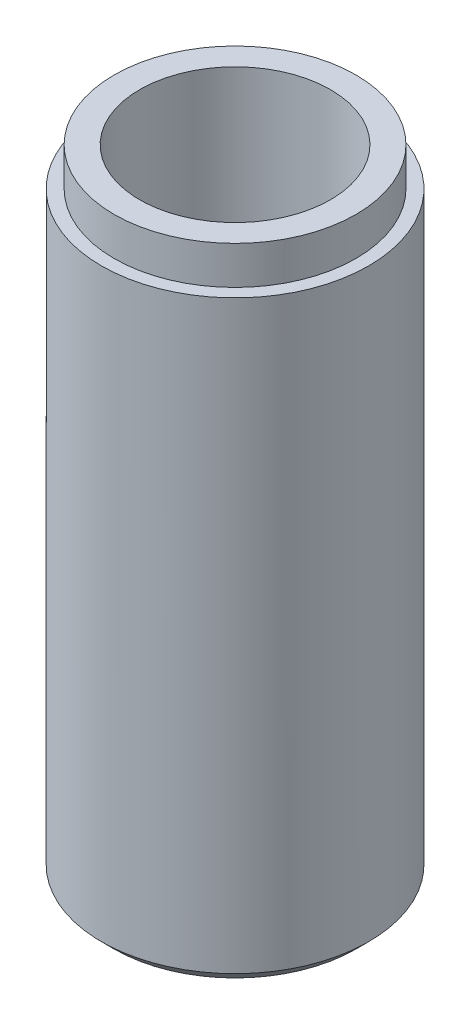
ISO-10303-21;
HEADER;
FILE_DESCRIPTION(('STEP AP214'),'2;1');
FILE_NAME('part.step','',(''),(''),'','','');
FILE_SCHEMA(('AUTOMOTIVE_DESIGN { 1 0 10303 214 1 1 1 1 }'));
ENDSEC;
DATA;
#1=APPLICATION_CONTEXT('core data for automotive mechanical design processes');
#2=APPLICATION_PROTOCOL_DEFINITION('international standard','automotive_design',2000,#1);
#3=PRODUCT_CONTEXT('',#1,'mechanical');
#4=PRODUCT('Part','Part','',(#3));
#5=PRODUCT_RELATED_PRODUCT_CATEGORY('part','',(#4));
#6=PRODUCT_DEFINITION_FORMATION('','',#4);
#7=PRODUCT_DEFINITION_CONTEXT('part definition',#1,'design');
#8=PRODUCT_DEFINITION('design','',#6,#7);
#9=PRODUCT_DEFINITION_SHAPE('','',#8);
#10=(LENGTH_UNIT() NAMED_UNIT(*) SI_UNIT(.MILLI.,.METRE.));
#11=(NAMED_UNIT(*) PLANE_ANGLE_UNIT() SI_UNIT($,.RADIAN.));
#12=(NAMED_UNIT(*) SI_UNIT($,.STERADIAN.) SOLID_ANGLE_UNIT());
#13=UNCERTAINTY_MEASURE_WITH_UNIT(LENGTH_MEASURE(1.E-05),#10,'distance_accuracy_value','');
#14=(GEOMETRIC_REPRESENTATION_CONTEXT(3) GLOBAL_UNCERTAINTY_ASSIGNED_CONTEXT((#13)) GLOBAL_UNIT_ASSIGNED_CONTEXT((#10,
#11,#12)) REPRESENTATION_CONTEXT('',''));
#15=CARTESIAN_POINT('',(0.,0.,0.));
#16=DIRECTION('',(0.,0.,1.));
#17=DIRECTION('',(1.,0.,0.));
#18=AXIS2_PLACEMENT_3D('',#15,#16,#17);
#19=CARTESIAN_POINT('',(0.,0.,0.));
#20=DIRECTION('',(0.,-1.,0.));
#21=DIRECTION('',(0.,0.,-1.));
#22=AXIS2_PLACEMENT_3D('',#19,#20,#21);
#23=CYLINDRICAL_SURFACE('',#22,10.5);
#24=CARTESIAN_POINT('',(0.,0.999999999999982,0.));
#25=DIRECTION('',(0.,-1.,0.));
#26=DIRECTION('',(0.,0.,-1.));
#27=AXIS2_PLACEMENT_3D('',#24,#25,#26);
#28=CIRCLE('',#27,10.5);
#29=CARTESIAN_POINT('',(0.,0.999999999999982,-10.5));
#30=VERTEX_POINT('',#29);
#31=EDGE_CURVE('E11',#30,#30,#28,.F.);
#32=ORIENTED_EDGE('',*,*,#31,.T.);
#33=EDGE_LOOP('',(#32));
#34=FACE_BOUND('',#33,.T.);
#35=CARTESIAN_POINT('',(0.,47.,0.));
#36=DIRECTION('',(0.,1.,0.));
#37=DIRECTION('',(0.,0.,1.));
#38=AXIS2_PLACEMENT_3D('',#35,#36,#37);
#39=CIRCLE('',#38,10.5);
#40=CARTESIAN_POINT('',(0.,47.,10.5));
#41=VERTEX_POINT('',#40);
#42=EDGE_CURVE('E35',#41,#41,#39,.F.);
#43=ORIENTED_EDGE('',*,*,#42,.T.);
#44=EDGE_LOOP('',(#43));
#45=FACE_BOUND('',#44,.T.);
#46=ADVANCED_FACE('F31',(#34,#45),#23,.T.);
#47=CARTESIAN_POINT('',(7.5,50.,0.));
#48=DIRECTION('',(0.,1.,0.));
#49=DIRECTION('',(0.,0.,1.));
#50=AXIS2_PLACEMENT_3D('',#47,#48,#49);
#51=PLANE('',#50);
#52=CARTESIAN_POINT('',(0.,50.,0.));
#53=DIRECTION('',(0.,-1.,0.));
#54=DIRECTION('',(0.,0.,-1.));
#55=AXIS2_PLACEMENT_3D('',#52,#53,#54);
#56=CIRCLE('',#55,7.5);
#57=CARTESIAN_POINT('',(0.,50.,-7.5));
#58=VERTEX_POINT('',#57);
#59=EDGE_CURVE('E43',#58,#58,#56,.T.);
#60=ORIENTED_EDGE('',*,*,#59,.T.);
#61=EDGE_LOOP('',(#60));
#62=FACE_BOUND('',#61,.T.);
#63=CARTESIAN_POINT('',(0.,50.,0.));
#64=DIRECTION('',(0.,1.,0.));
#65=DIRECTION('',(0.,0.,1.));
#66=AXIS2_PLACEMENT_3D('',#63,#64,#65);
#67=CIRCLE('',#66,9.5);
#68=CARTESIAN_POINT('',(0.,50.,9.5));
#69=VERTEX_POINT('',#68);
#70=EDGE_CURVE('E51',#69,#69,#67,.T.);
#71=ORIENTED_EDGE('',*,*,#70,.T.);
#72=EDGE_LOOP('',(#71));
#73=FACE_BOUND('',#72,.T.);
#74=ADVANCED_FACE('F76',(#62,#73),#51,.T.);
#75=CARTESIAN_POINT('',(10.5,0.,0.));
#76=DIRECTION('',(0.,-1.,0.));
#77=DIRECTION('',(0.,0.,-1.));
#78=AXIS2_PLACEMENT_3D('',#75,#76,#77);
#79=PLANE('',#78);
#80=CARTESIAN_POINT('',(0.,0.,0.));
#81=DIRECTION('',(0.,-1.,0.));
#82=DIRECTION('',(0.,0.,-1.));
#83=AXIS2_PLACEMENT_3D('',#80,#81,#82);
#84=CIRCLE('',#83,9.50000000000002);
#85=CARTESIAN_POINT('',(0.,0.,-9.50000000000002));
#86=VERTEX_POINT('',#85);
#87=EDGE_CURVE('E39',#86,#86,#84,.T.);
#88=ORIENTED_EDGE('',*,*,#87,.T.);
#89=EDGE_LOOP('',(#88));
#90=FACE_BOUND('',#89,.T.);
#91=CARTESIAN_POINT('',(0.,0.,0.));
#92=DIRECTION('',(0.,-1.,0.));
#93=DIRECTION('',(0.,0.,-1.));
#94=AXIS2_PLACEMENT_3D('',#91,#92,#93);
#95=CIRCLE('',#94,7.5);
#96=CARTESIAN_POINT('',(0.,0.,-7.5));
#97=VERTEX_POINT('',#96);
#98=EDGE_CURVE('E48',#97,#97,#95,.T.);
#99=ORIENTED_EDGE('',*,*,#98,.F.);
#100=EDGE_LOOP('',(#99));
#101=FACE_BOUND('',#100,.T.);
#102=ADVANCED_FACE('F81',(#90,#101),#79,.T.);
#103=CARTESIAN_POINT('',(0.,0.,0.));
#104=DIRECTION('',(0.,-1.,0.));
#105=DIRECTION('',(0.,0.,-1.));
#106=AXIS2_PLACEMENT_3D('',#103,#104,#105);
#107=CYLINDRICAL_SURFACE('',#106,7.5);
#108=ORIENTED_EDGE('',*,*,#98,.T.);
#109=EDGE_LOOP('',(#108));
#110=FACE_BOUND('',#109,.T.);
#111=ORIENTED_EDGE('',*,*,#59,.F.);
#112=EDGE_LOOP('',(#111));
#113=FACE_BOUND('',#112,.T.);
#114=ADVANCED_FACE('F72',(#110,#113),#107,.F.);
#115=CARTESIAN_POINT('',(0.,0.,0.));
#116=DIRECTION('',(0.,1.,0.));
#117=DIRECTION('',(0.,0.,1.));
#118=AXIS2_PLACEMENT_3D('',#115,#116,#117);
#119=CONICAL_SURFACE('',#118,9.50000000000002,0.785398163397448);
#120=ORIENTED_EDGE('',*,*,#31,.F.);
#121=EDGE_LOOP('',(#120));
#122=FACE_BOUND('',#121,.T.);
#123=ORIENTED_EDGE('',*,*,#87,.F.);
#124=EDGE_LOOP('',(#123));
#125=FACE_BOUND('',#124,.T.);
#126=ADVANCED_FACE('F33',(#122,#125),#119,.T.);
#127=CARTESIAN_POINT('',(0.,47.,0.));
#128=DIRECTION('',(0.,1.,0.));
#129=DIRECTION('',(0.,0.,1.));
#130=AXIS2_PLACEMENT_3D('',#127,#128,#129);
#131=PLANE('',#130);
#132=ORIENTED_EDGE('',*,*,#42,.F.);
#133=EDGE_LOOP('',(#132));
#134=FACE_BOUND('',#133,.T.);
#135=CARTESIAN_POINT('',(0.,47.,0.));
#136=DIRECTION('',(0.,1.,0.));
#137=DIRECTION('',(0.,0.,1.));
#138=AXIS2_PLACEMENT_3D('',#135,#136,#137);
#139=CIRCLE('',#138,9.5);
#140=CARTESIAN_POINT('',(0.,47.,9.5));
#141=VERTEX_POINT('',#140);
#142=EDGE_CURVE('E54',#141,#141,#139,.T.);
#143=ORIENTED_EDGE('',*,*,#142,.F.);
#144=EDGE_LOOP('',(#143));
#145=FACE_BOUND('',#144,.T.);
#146=ADVANCED_FACE('F62',(#134,#145),#131,.T.);
#147=CARTESIAN_POINT('',(0.,47.,0.));
#148=DIRECTION('',(0.,1.,0.));
#149=DIRECTION('',(0.,0.,1.));
#150=AXIS2_PLACEMENT_3D('',#147,#148,#149);
#151=CYLINDRICAL_SURFACE('',#150,9.5);
#152=ORIENTED_EDGE('',*,*,#142,.T.);
#153=EDGE_LOOP('',(#152));
#154=FACE_BOUND('',#153,.T.);
#155=ORIENTED_EDGE('',*,*,#70,.F.);
#156=EDGE_LOOP('',(#155));
#157=FACE_BOUND('',#156,.T.);
#158=ADVANCED_FACE('F65',(#154,#157),#151,.T.);
#159=CLOSED_SHELL('',(#46,#74,#102,#114,#126,#146,#158));
#160=MANIFOLD_SOLID_BREP('B2',#159);
#161=ADVANCED_BREP_SHAPE_REPRESENTATION('',(#18,#160),#14);
#162=SHAPE_DEFINITION_REPRESENTATION(#9,#161);
ENDSEC;
END-ISO-10303-21;
